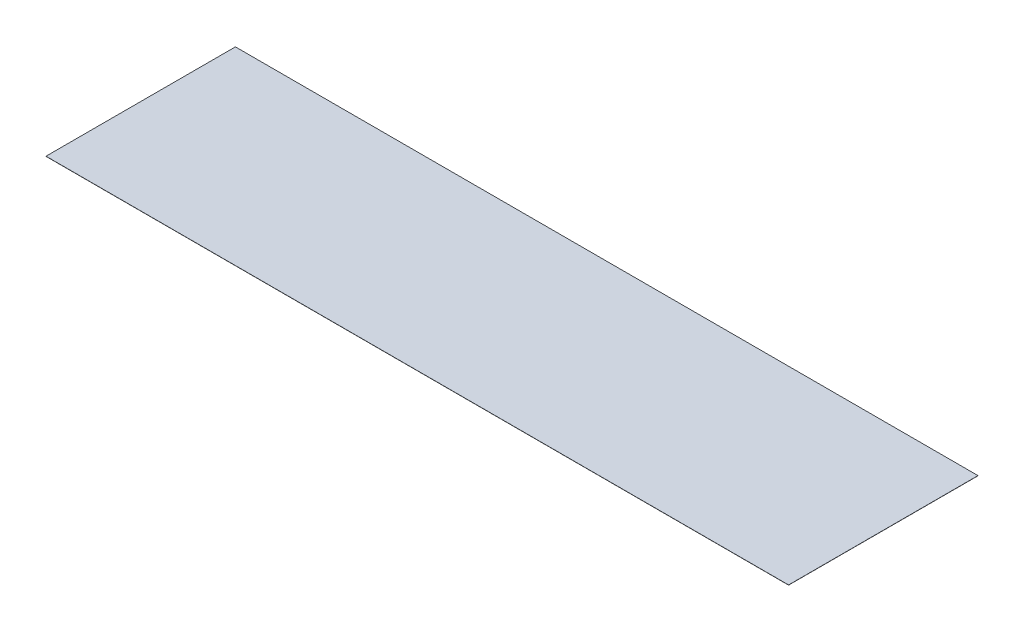
ISO-10303-21;
HEADER;
FILE_DESCRIPTION(('STEP AP214'),'2;1');
FILE_NAME('part.step','',(''),(''),'','','');
FILE_SCHEMA(('AUTOMOTIVE_DESIGN { 1 0 10303 214 1 1 1 1 }'));
ENDSEC;
DATA;
#1=APPLICATION_CONTEXT('core data for automotive mechanical design processes');
#2=APPLICATION_PROTOCOL_DEFINITION('international standard','automotive_design',2000,#1);
#3=PRODUCT_CONTEXT('',#1,'mechanical');
#4=PRODUCT('Part','Part','',(#3));
#5=PRODUCT_RELATED_PRODUCT_CATEGORY('part','',(#4));
#6=PRODUCT_DEFINITION_FORMATION('','',#4);
#7=PRODUCT_DEFINITION_CONTEXT('part definition',#1,'design');
#8=PRODUCT_DEFINITION('design','',#6,#7);
#9=PRODUCT_DEFINITION_SHAPE('','',#8);
#10=(LENGTH_UNIT() NAMED_UNIT(*) SI_UNIT(.MILLI.,.METRE.));
#11=(NAMED_UNIT(*) PLANE_ANGLE_UNIT() SI_UNIT($,.RADIAN.));
#12=(NAMED_UNIT(*) SI_UNIT($,.STERADIAN.) SOLID_ANGLE_UNIT());
#13=UNCERTAINTY_MEASURE_WITH_UNIT(LENGTH_MEASURE(1.E-05),#10,'distance_accuracy_value','');
#14=(GEOMETRIC_REPRESENTATION_CONTEXT(3) GLOBAL_UNCERTAINTY_ASSIGNED_CONTEXT((#13)) GLOBAL_UNIT_ASSIGNED_CONTEXT((#10,
#11,#12)) REPRESENTATION_CONTEXT('',''));
#15=CARTESIAN_POINT('',(0.,0.,0.));
#16=DIRECTION('',(0.,0.,1.));
#17=DIRECTION('',(1.,0.,0.));
#18=AXIS2_PLACEMENT_3D('',#15,#16,#17);
#19=CARTESIAN_POINT('',(0.,0.0762,0.));
#20=DIRECTION('',(1.,0.,0.));
#21=DIRECTION('',(0.,0.,-1.));
#22=AXIS2_PLACEMENT_3D('',#19,#20,#21);
#23=PLANE('',#22);
#24=DIRECTION('',(0.,0.,1.));
#25=VECTOR('',#24,1.);
#26=CARTESIAN_POINT('',(0.,0.,0.));
#27=LINE('',#26,#25);
#28=CARTESIAN_POINT('',(0.,0.,-82.));
#29=VERTEX_POINT('',#28);
#30=CARTESIAN_POINT('',(0.,0.,0.));
#31=VERTEX_POINT('',#30);
#32=EDGE_CURVE('E95',#29,#31,#27,.T.);
#33=ORIENTED_EDGE('',*,*,#32,.T.);
#34=DIRECTION('',(0.,-1.,0.));
#35=VECTOR('',#34,1.);
#36=CARTESIAN_POINT('',(0.,0.0762,0.));
#37=LINE('',#36,#35);
#38=CARTESIAN_POINT('',(0.,0.0762,0.));
#39=VERTEX_POINT('',#38);
#40=EDGE_CURVE('E11',#39,#31,#37,.T.);
#41=ORIENTED_EDGE('',*,*,#40,.F.);
#42=DIRECTION('',(0.,0.,1.));
#43=VECTOR('',#42,1.);
#44=CARTESIAN_POINT('',(0.,0.0762,0.));
#45=LINE('',#44,#43);
#46=CARTESIAN_POINT('',(0.,0.0762,-82.));
#47=VERTEX_POINT('',#46);
#48=EDGE_CURVE('E83',#47,#39,#45,.T.);
#49=ORIENTED_EDGE('',*,*,#48,.F.);
#50=DIRECTION('',(0.,-1.,0.));
#51=VECTOR('',#50,1.);
#52=CARTESIAN_POINT('',(0.,0.0762,-82.));
#53=LINE('',#52,#51);
#54=EDGE_CURVE('E91',#47,#29,#53,.T.);
#55=ORIENTED_EDGE('',*,*,#54,.T.);
#56=EDGE_LOOP('',(#33,#41,#49,#55));
#57=FACE_BOUND('',#56,.T.);
#58=ADVANCED_FACE('F32',(#57),#23,.F.);
#59=CARTESIAN_POINT('',(0.,0.0762,0.));
#60=DIRECTION('',(0.,0.,-1.));
#61=DIRECTION('',(-1.,0.,0.));
#62=AXIS2_PLACEMENT_3D('',#59,#60,#61);
#63=PLANE('',#62);
#64=DIRECTION('',(1.,0.,0.));
#65=VECTOR('',#64,1.);
#66=CARTESIAN_POINT('',(0.,0.,0.));
#67=LINE('',#66,#65);
#68=CARTESIAN_POINT('',(321.5,0.,0.));
#69=VERTEX_POINT('',#68);
#70=EDGE_CURVE('E87',#31,#69,#67,.T.);
#71=ORIENTED_EDGE('',*,*,#70,.T.);
#72=DIRECTION('',(0.,-1.,0.));
#73=VECTOR('',#72,1.);
#74=CARTESIAN_POINT('',(321.5,0.0762,0.));
#75=LINE('',#74,#73);
#76=CARTESIAN_POINT('',(321.5,0.0762,0.));
#77=VERTEX_POINT('',#76);
#78=EDGE_CURVE('E40',#77,#69,#75,.T.);
#79=ORIENTED_EDGE('',*,*,#78,.F.);
#80=DIRECTION('',(1.,0.,0.));
#81=VECTOR('',#80,1.);
#82=CARTESIAN_POINT('',(0.,0.0762,0.));
#83=LINE('',#82,#81);
#84=EDGE_CURVE('E78',#39,#77,#83,.T.);
#85=ORIENTED_EDGE('',*,*,#84,.F.);
#86=ORIENTED_EDGE('',*,*,#40,.T.);
#87=EDGE_LOOP('',(#71,#79,#85,#86));
#88=FACE_BOUND('',#87,.T.);
#89=ADVANCED_FACE('F86',(#88),#63,.F.);
#90=CARTESIAN_POINT('',(321.5,0.0762,0.));
#91=DIRECTION('',(-1.,0.,0.));
#92=DIRECTION('',(0.,0.,1.));
#93=AXIS2_PLACEMENT_3D('',#90,#91,#92);
#94=PLANE('',#93);
#95=DIRECTION('',(0.,0.,-1.));
#96=VECTOR('',#95,1.);
#97=CARTESIAN_POINT('',(321.5,0.,0.));
#98=LINE('',#97,#96);
#99=CARTESIAN_POINT('',(321.5,0.,-82.));
#100=VERTEX_POINT('',#99);
#101=EDGE_CURVE('E65',#69,#100,#98,.T.);
#102=ORIENTED_EDGE('',*,*,#101,.T.);
#103=DIRECTION('',(0.,-1.,0.));
#104=VECTOR('',#103,1.);
#105=CARTESIAN_POINT('',(321.5,0.0762,-82.));
#106=LINE('',#105,#104);
#107=CARTESIAN_POINT('',(321.5,0.0762,-82.));
#108=VERTEX_POINT('',#107);
#109=EDGE_CURVE('E88',#108,#100,#106,.T.);
#110=ORIENTED_EDGE('',*,*,#109,.F.);
#111=DIRECTION('',(0.,0.,-1.));
#112=VECTOR('',#111,1.);
#113=CARTESIAN_POINT('',(321.5,0.0762,0.));
#114=LINE('',#113,#112);
#115=EDGE_CURVE('E81',#77,#108,#114,.T.);
#116=ORIENTED_EDGE('',*,*,#115,.F.);
#117=ORIENTED_EDGE('',*,*,#78,.T.);
#118=EDGE_LOOP('',(#102,#110,#116,#117));
#119=FACE_BOUND('',#118,.T.);
#120=ADVANCED_FACE('F89',(#119),#94,.F.);
#121=CARTESIAN_POINT('',(0.,0.0762,-82.));
#122=DIRECTION('',(0.,0.,1.));
#123=DIRECTION('',(1.,0.,0.));
#124=AXIS2_PLACEMENT_3D('',#121,#122,#123);
#125=PLANE('',#124);
#126=DIRECTION('',(-1.,0.,0.));
#127=VECTOR('',#126,1.);
#128=CARTESIAN_POINT('',(0.,0.,-82.));
#129=LINE('',#128,#127);
#130=EDGE_CURVE('E71',#100,#29,#129,.T.);
#131=ORIENTED_EDGE('',*,*,#130,.T.);
#132=ORIENTED_EDGE('',*,*,#54,.F.);
#133=DIRECTION('',(-1.,0.,0.));
#134=VECTOR('',#133,1.);
#135=CARTESIAN_POINT('',(0.,0.0762,-82.));
#136=LINE('',#135,#134);
#137=EDGE_CURVE('E48',#108,#47,#136,.T.);
#138=ORIENTED_EDGE('',*,*,#137,.F.);
#139=ORIENTED_EDGE('',*,*,#109,.T.);
#140=EDGE_LOOP('',(#131,#132,#138,#139));
#141=FACE_BOUND('',#140,.T.);
#142=ADVANCED_FACE('F102',(#141),#125,.F.);
#143=CARTESIAN_POINT('',(0.,0.0762,-82.));
#144=DIRECTION('',(0.,-1.,0.));
#145=DIRECTION('',(0.,0.,-1.));
#146=AXIS2_PLACEMENT_3D('',#143,#144,#145);
#147=PLANE('',#146);
#148=ORIENTED_EDGE('',*,*,#48,.T.);
#149=ORIENTED_EDGE('',*,*,#84,.T.);
#150=ORIENTED_EDGE('',*,*,#115,.T.);
#151=ORIENTED_EDGE('',*,*,#137,.T.);
#152=EDGE_LOOP('',(#148,#149,#150,#151));
#153=FACE_BOUND('',#152,.T.);
#154=ADVANCED_FACE('F79',(#153),#147,.F.);
#155=CARTESIAN_POINT('',(0.,0.,-82.));
#156=DIRECTION('',(0.,-1.,0.));
#157=DIRECTION('',(0.,0.,-1.));
#158=AXIS2_PLACEMENT_3D('',#155,#156,#157);
#159=PLANE('',#158);
#160=ORIENTED_EDGE('',*,*,#32,.F.);
#161=ORIENTED_EDGE('',*,*,#130,.F.);
#162=ORIENTED_EDGE('',*,*,#101,.F.);
#163=ORIENTED_EDGE('',*,*,#70,.F.);
#164=EDGE_LOOP('',(#160,#161,#162,#163));
#165=FACE_BOUND('',#164,.T.);
#166=ADVANCED_FACE('F105',(#165),#159,.T.);
#167=CLOSED_SHELL('',(#58,#89,#120,#142,#154,#166));
#168=MANIFOLD_SOLID_BREP('B2',#167);
#169=ADVANCED_BREP_SHAPE_REPRESENTATION('',(#18,#168),#14);
#170=SHAPE_DEFINITION_REPRESENTATION(#9,#169);
ENDSEC;
END-ISO-10303-21;
